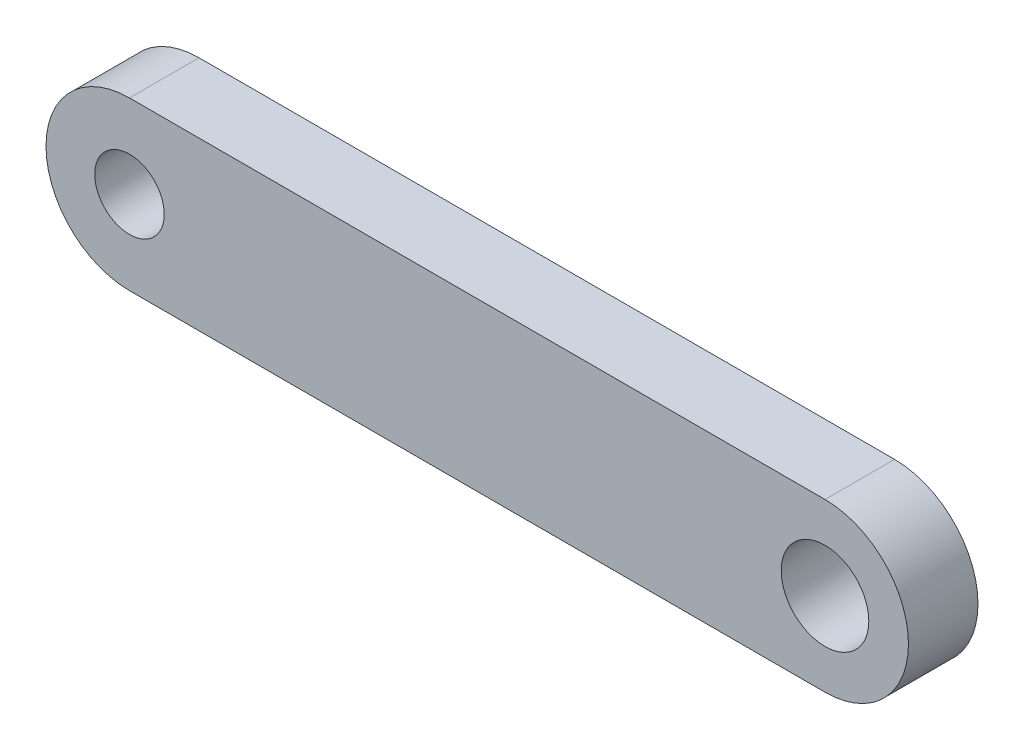
ISO-10303-21;
HEADER;
FILE_DESCRIPTION(('STEP AP214'),'2;1');
FILE_NAME('part.step','',(''),(''),'','','');
FILE_SCHEMA(('AUTOMOTIVE_DESIGN { 1 0 10303 214 1 1 1 1 }'));
ENDSEC;
DATA;
#1=APPLICATION_CONTEXT('core data for automotive mechanical design processes');
#2=APPLICATION_PROTOCOL_DEFINITION('international standard','automotive_design',2000,#1);
#3=PRODUCT_CONTEXT('',#1,'mechanical');
#4=PRODUCT('Part','Part','',(#3));
#5=PRODUCT_RELATED_PRODUCT_CATEGORY('part','',(#4));
#6=PRODUCT_DEFINITION_FORMATION('','',#4);
#7=PRODUCT_DEFINITION_CONTEXT('part definition',#1,'design');
#8=PRODUCT_DEFINITION('design','',#6,#7);
#9=PRODUCT_DEFINITION_SHAPE('','',#8);
#10=(LENGTH_UNIT() NAMED_UNIT(*) SI_UNIT(.MILLI.,.METRE.));
#11=(NAMED_UNIT(*) PLANE_ANGLE_UNIT() SI_UNIT($,.RADIAN.));
#12=(NAMED_UNIT(*) SI_UNIT($,.STERADIAN.) SOLID_ANGLE_UNIT());
#13=UNCERTAINTY_MEASURE_WITH_UNIT(LENGTH_MEASURE(1.E-05),#10,'distance_accuracy_value','');
#14=(GEOMETRIC_REPRESENTATION_CONTEXT(3) GLOBAL_UNCERTAINTY_ASSIGNED_CONTEXT((#13)) GLOBAL_UNIT_ASSIGNED_CONTEXT((#10,
#11,#12)) REPRESENTATION_CONTEXT('',''));
#15=CARTESIAN_POINT('',(0.,0.,0.));
#16=DIRECTION('',(0.,0.,1.));
#17=DIRECTION('',(1.,0.,0.));
#18=AXIS2_PLACEMENT_3D('',#15,#16,#17);
#19=CARTESIAN_POINT('',(50.,6.,5.));
#20=DIRECTION('',(0.,0.,-1.));
#21=DIRECTION('',(-1.,0.,0.));
#22=AXIS2_PLACEMENT_3D('',#19,#20,#21);
#23=CYLINDRICAL_SURFACE('',#22,6.);
#24=CARTESIAN_POINT('',(50.,6.,0.));
#25=DIRECTION('',(0.,0.,1.));
#26=DIRECTION('',(1.,0.,0.));
#27=AXIS2_PLACEMENT_3D('',#24,#25,#26);
#28=CIRCLE('',#27,6.);
#29=CARTESIAN_POINT('',(50.,0.,0.));
#30=VERTEX_POINT('',#29);
#31=CARTESIAN_POINT('',(50.,12.,0.));
#32=VERTEX_POINT('',#31);
#33=EDGE_CURVE('E106',#30,#32,#28,.T.);
#34=ORIENTED_EDGE('',*,*,#33,.T.);
#35=DIRECTION('',(0.,0.,-1.));
#36=VECTOR('',#35,1.);
#37=CARTESIAN_POINT('',(50.,12.,5.));
#38=LINE('',#37,#36);
#39=CARTESIAN_POINT('',(50.,12.,5.));
#40=VERTEX_POINT('',#39);
#41=EDGE_CURVE('E11',#40,#32,#38,.T.);
#42=ORIENTED_EDGE('',*,*,#41,.F.);
#43=CARTESIAN_POINT('',(50.,6.,5.));
#44=DIRECTION('',(0.,0.,1.));
#45=DIRECTION('',(1.,0.,0.));
#46=AXIS2_PLACEMENT_3D('',#43,#44,#45);
#47=CIRCLE('',#46,6.);
#48=CARTESIAN_POINT('',(50.,0.,5.));
#49=VERTEX_POINT('',#48);
#50=EDGE_CURVE('E77',#49,#40,#47,.T.);
#51=ORIENTED_EDGE('',*,*,#50,.F.);
#52=DIRECTION('',(0.,0.,-1.));
#53=VECTOR('',#52,1.);
#54=CARTESIAN_POINT('',(50.,0.,5.));
#55=LINE('',#54,#53);
#56=EDGE_CURVE('E105',#49,#30,#55,.T.);
#57=ORIENTED_EDGE('',*,*,#56,.T.);
#58=EDGE_LOOP('',(#34,#42,#51,#57));
#59=FACE_BOUND('',#58,.T.);
#60=ADVANCED_FACE('F35',(#59),#23,.T.);
#61=CARTESIAN_POINT('',(0.,12.,5.));
#62=DIRECTION('',(0.,1.,0.));
#63=DIRECTION('',(0.,0.,1.));
#64=AXIS2_PLACEMENT_3D('',#61,#62,#63);
#65=PLANE('',#64);
#66=DIRECTION('',(1.,0.,0.));
#67=VECTOR('',#66,1.);
#68=CARTESIAN_POINT('',(0.,12.,0.));
#69=LINE('',#68,#67);
#70=CARTESIAN_POINT('',(0.,12.,0.));
#71=VERTEX_POINT('',#70);
#72=EDGE_CURVE('E87',#71,#32,#69,.T.);
#73=ORIENTED_EDGE('',*,*,#72,.F.);
#74=DIRECTION('',(0.,0.,-1.));
#75=VECTOR('',#74,1.);
#76=CARTESIAN_POINT('',(0.,12.,5.));
#77=LINE('',#76,#75);
#78=CARTESIAN_POINT('',(0.,12.,5.));
#79=VERTEX_POINT('',#78);
#80=EDGE_CURVE('E43',#79,#71,#77,.T.);
#81=ORIENTED_EDGE('',*,*,#80,.F.);
#82=DIRECTION('',(1.,0.,0.));
#83=VECTOR('',#82,1.);
#84=CARTESIAN_POINT('',(0.,12.,5.));
#85=LINE('',#84,#83);
#86=EDGE_CURVE('E85',#79,#40,#85,.T.);
#87=ORIENTED_EDGE('',*,*,#86,.T.);
#88=ORIENTED_EDGE('',*,*,#41,.T.);
#89=EDGE_LOOP('',(#73,#81,#87,#88));
#90=FACE_BOUND('',#89,.T.);
#91=ADVANCED_FACE('F84',(#90),#65,.T.);
#92=CARTESIAN_POINT('',(0.,6.,5.));
#93=DIRECTION('',(0.,0.,-1.));
#94=DIRECTION('',(-1.,0.,0.));
#95=AXIS2_PLACEMENT_3D('',#92,#93,#94);
#96=CYLINDRICAL_SURFACE('',#95,6.);
#97=CARTESIAN_POINT('',(0.,6.,0.));
#98=DIRECTION('',(0.,0.,1.));
#99=DIRECTION('',(1.,0.,0.));
#100=AXIS2_PLACEMENT_3D('',#97,#98,#99);
#101=CIRCLE('',#100,6.);
#102=CARTESIAN_POINT('',(0.,0.,0.));
#103=VERTEX_POINT('',#102);
#104=EDGE_CURVE('E66',#71,#103,#101,.T.);
#105=ORIENTED_EDGE('',*,*,#104,.T.);
#106=DIRECTION('',(0.,0.,-1.));
#107=VECTOR('',#106,1.);
#108=CARTESIAN_POINT('',(0.,0.,5.));
#109=LINE('',#108,#107);
#110=CARTESIAN_POINT('',(0.,0.,5.));
#111=VERTEX_POINT('',#110);
#112=EDGE_CURVE('E88',#111,#103,#109,.T.);
#113=ORIENTED_EDGE('',*,*,#112,.F.);
#114=CARTESIAN_POINT('',(0.,6.,5.));
#115=DIRECTION('',(0.,0.,1.));
#116=DIRECTION('',(1.,0.,0.));
#117=AXIS2_PLACEMENT_3D('',#114,#115,#116);
#118=CIRCLE('',#117,6.);
#119=EDGE_CURVE('E89',#79,#111,#118,.T.);
#120=ORIENTED_EDGE('',*,*,#119,.F.);
#121=ORIENTED_EDGE('',*,*,#80,.T.);
#122=EDGE_LOOP('',(#105,#113,#120,#121));
#123=FACE_BOUND('',#122,.T.);
#124=ADVANCED_FACE('F90',(#123),#96,.T.);
#125=CARTESIAN_POINT('',(50.,6.,5.));
#126=DIRECTION('',(0.,0.,-1.));
#127=DIRECTION('',(-1.,0.,0.));
#128=AXIS2_PLACEMENT_3D('',#125,#126,#127);
#129=CYLINDRICAL_SURFACE('',#128,3.15);
#130=CARTESIAN_POINT('',(50.,6.,5.));
#131=DIRECTION('',(0.,0.,1.));
#132=DIRECTION('',(1.,0.,0.));
#133=AXIS2_PLACEMENT_3D('',#130,#131,#132);
#134=CIRCLE('',#133,3.15);
#135=CARTESIAN_POINT('',(53.15,6.,5.));
#136=VERTEX_POINT('',#135);
#137=EDGE_CURVE('E99',#136,#136,#134,.T.);
#138=ORIENTED_EDGE('',*,*,#137,.T.);
#139=EDGE_LOOP('',(#138));
#140=FACE_BOUND('',#139,.T.);
#141=CARTESIAN_POINT('',(50.,6.,0.));
#142=DIRECTION('',(0.,0.,1.));
#143=DIRECTION('',(1.,0.,0.));
#144=AXIS2_PLACEMENT_3D('',#141,#142,#143);
#145=CIRCLE('',#144,3.15);
#146=CARTESIAN_POINT('',(53.15,6.,0.));
#147=VERTEX_POINT('',#146);
#148=EDGE_CURVE('E112',#147,#147,#145,.T.);
#149=ORIENTED_EDGE('',*,*,#148,.F.);
#150=EDGE_LOOP('',(#149));
#151=FACE_BOUND('',#150,.T.);
#152=ADVANCED_FACE('F131',(#140,#151),#129,.F.);
#153=CARTESIAN_POINT('',(0.,0.,5.));
#154=DIRECTION('',(0.,1.,0.));
#155=DIRECTION('',(0.,0.,1.));
#156=AXIS2_PLACEMENT_3D('',#153,#154,#155);
#157=PLANE('',#156);
#158=DIRECTION('',(1.,0.,0.));
#159=VECTOR('',#158,1.);
#160=CARTESIAN_POINT('',(0.,0.,0.));
#161=LINE('',#160,#159);
#162=EDGE_CURVE('E72',#103,#30,#161,.T.);
#163=ORIENTED_EDGE('',*,*,#162,.T.);
#164=ORIENTED_EDGE('',*,*,#56,.F.);
#165=DIRECTION('',(1.,0.,0.));
#166=VECTOR('',#165,1.);
#167=CARTESIAN_POINT('',(0.,0.,5.));
#168=LINE('',#167,#166);
#169=EDGE_CURVE('E51',#111,#49,#168,.T.);
#170=ORIENTED_EDGE('',*,*,#169,.F.);
#171=ORIENTED_EDGE('',*,*,#112,.T.);
#172=EDGE_LOOP('',(#163,#164,#170,#171));
#173=FACE_BOUND('',#172,.T.);
#174=ADVANCED_FACE('F118',(#173),#157,.F.);
#175=CARTESIAN_POINT('',(0.,6.,5.));
#176=DIRECTION('',(0.,0.,-1.));
#177=DIRECTION('',(-1.,0.,0.));
#178=AXIS2_PLACEMENT_3D('',#175,#176,#177);
#179=CYLINDRICAL_SURFACE('',#178,2.5);
#180=CARTESIAN_POINT('',(0.,6.,5.));
#181=DIRECTION('',(0.,0.,1.));
#182=DIRECTION('',(1.,0.,0.));
#183=AXIS2_PLACEMENT_3D('',#180,#181,#182);
#184=CIRCLE('',#183,2.5);
#185=CARTESIAN_POINT('',(2.5,6.,5.));
#186=VERTEX_POINT('',#185);
#187=EDGE_CURVE('E102',#186,#186,#184,.T.);
#188=ORIENTED_EDGE('',*,*,#187,.T.);
#189=EDGE_LOOP('',(#188));
#190=FACE_BOUND('',#189,.T.);
#191=CARTESIAN_POINT('',(0.,6.,0.));
#192=DIRECTION('',(0.,0.,1.));
#193=DIRECTION('',(1.,0.,0.));
#194=AXIS2_PLACEMENT_3D('',#191,#192,#193);
#195=CIRCLE('',#194,2.5);
#196=CARTESIAN_POINT('',(2.5,6.,0.));
#197=VERTEX_POINT('',#196);
#198=EDGE_CURVE('E95',#197,#197,#195,.T.);
#199=ORIENTED_EDGE('',*,*,#198,.F.);
#200=EDGE_LOOP('',(#199));
#201=FACE_BOUND('',#200,.T.);
#202=ADVANCED_FACE('F136',(#190,#201),#179,.F.);
#203=CARTESIAN_POINT('',(0.,0.,5.));
#204=DIRECTION('',(0.,0.,1.));
#205=DIRECTION('',(1.,0.,0.));
#206=AXIS2_PLACEMENT_3D('',#203,#204,#205);
#207=PLANE('',#206);
#208=ORIENTED_EDGE('',*,*,#50,.T.);
#209=ORIENTED_EDGE('',*,*,#86,.F.);
#210=ORIENTED_EDGE('',*,*,#119,.T.);
#211=ORIENTED_EDGE('',*,*,#169,.T.);
#212=EDGE_LOOP('',(#208,#209,#210,#211));
#213=FACE_BOUND('',#212,.T.);
#214=ORIENTED_EDGE('',*,*,#137,.F.);
#215=EDGE_LOOP('',(#214));
#216=FACE_BOUND('',#215,.T.);
#217=ORIENTED_EDGE('',*,*,#187,.F.);
#218=EDGE_LOOP('',(#217));
#219=FACE_BOUND('',#218,.T.);
#220=ADVANCED_FACE('F92',(#213,#216,#219),#207,.T.);
#221=CARTESIAN_POINT('',(0.,0.,0.));
#222=DIRECTION('',(0.,0.,1.));
#223=DIRECTION('',(1.,0.,0.));
#224=AXIS2_PLACEMENT_3D('',#221,#222,#223);
#225=PLANE('',#224);
#226=ORIENTED_EDGE('',*,*,#33,.F.);
#227=ORIENTED_EDGE('',*,*,#162,.F.);
#228=ORIENTED_EDGE('',*,*,#104,.F.);
#229=ORIENTED_EDGE('',*,*,#72,.T.);
#230=EDGE_LOOP('',(#226,#227,#228,#229));
#231=FACE_BOUND('',#230,.T.);
#232=ORIENTED_EDGE('',*,*,#148,.T.);
#233=EDGE_LOOP('',(#232));
#234=FACE_BOUND('',#233,.T.);
#235=ORIENTED_EDGE('',*,*,#198,.T.);
#236=EDGE_LOOP('',(#235));
#237=FACE_BOUND('',#236,.T.);
#238=ADVANCED_FACE('F121',(#231,#234,#237),#225,.F.);
#239=CLOSED_SHELL('',(#60,#91,#124,#152,#174,#202,#220,#238));
#240=MANIFOLD_SOLID_BREP('B2',#239);
#241=ADVANCED_BREP_SHAPE_REPRESENTATION('',(#18,#240),#14);
#242=SHAPE_DEFINITION_REPRESENTATION(#9,#241);
ENDSEC;
END-ISO-10303-21;
